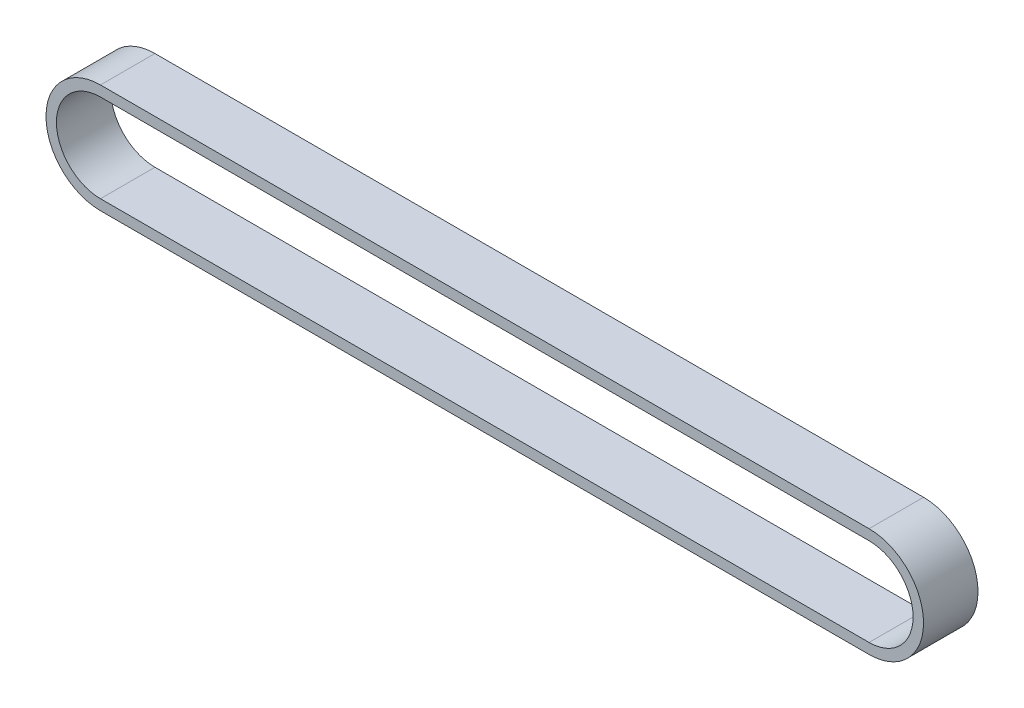
ISO-10303-21;
HEADER;
FILE_DESCRIPTION(('STEP AP214'),'2;1');
FILE_NAME('part.step','',(''),(''),'','','');
FILE_SCHEMA(('AUTOMOTIVE_DESIGN { 1 0 10303 214 1 1 1 1 }'));
ENDSEC;
DATA;
#1=APPLICATION_CONTEXT('core data for automotive mechanical design processes');
#2=APPLICATION_PROTOCOL_DEFINITION('international standard','automotive_design',2000,#1);
#3=PRODUCT_CONTEXT('',#1,'mechanical');
#4=PRODUCT('Part','Part','',(#3));
#5=PRODUCT_RELATED_PRODUCT_CATEGORY('part','',(#4));
#6=PRODUCT_DEFINITION_FORMATION('','',#4);
#7=PRODUCT_DEFINITION_CONTEXT('part definition',#1,'design');
#8=PRODUCT_DEFINITION('design','',#6,#7);
#9=PRODUCT_DEFINITION_SHAPE('','',#8);
#10=(LENGTH_UNIT() NAMED_UNIT(*) SI_UNIT(.MILLI.,.METRE.));
#11=(NAMED_UNIT(*) PLANE_ANGLE_UNIT() SI_UNIT($,.RADIAN.));
#12=(NAMED_UNIT(*) SI_UNIT($,.STERADIAN.) SOLID_ANGLE_UNIT());
#13=UNCERTAINTY_MEASURE_WITH_UNIT(LENGTH_MEASURE(1.E-05),#10,'distance_accuracy_value','');
#14=(GEOMETRIC_REPRESENTATION_CONTEXT(3) GLOBAL_UNCERTAINTY_ASSIGNED_CONTEXT((#13)) GLOBAL_UNIT_ASSIGNED_CONTEXT((#10,
#11,#12)) REPRESENTATION_CONTEXT('',''));
#15=CARTESIAN_POINT('',(0.,0.,0.));
#16=DIRECTION('',(0.,0.,1.));
#17=DIRECTION('',(1.,0.,0.));
#18=AXIS2_PLACEMENT_3D('',#15,#16,#17);
#19=CARTESIAN_POINT('',(-43.1077694235589,13.5338345864662,6.));
#20=DIRECTION('',(0.,0.,1.));
#21=DIRECTION('',(1.,0.,0.));
#22=AXIS2_PLACEMENT_3D('',#19,#20,#21);
#23=PLANE('',#22);
#24=CARTESIAN_POINT('',(-43.1077694235589,13.5338345864662,6.));
#25=DIRECTION('',(0.,0.,1.));
#26=DIRECTION('',(1.,0.,0.));
#27=AXIS2_PLACEMENT_3D('',#24,#25,#26);
#28=CIRCLE('',#27,6.);
#29=CARTESIAN_POINT('',(-43.1077694235589,19.5338345864662,6.));
#30=VERTEX_POINT('',#29);
#31=CARTESIAN_POINT('',(-43.1077694235589,7.53383458646616,6.));
#32=VERTEX_POINT('',#31);
#33=EDGE_CURVE('E134',#30,#32,#28,.T.);
#34=ORIENTED_EDGE('',*,*,#33,.T.);
#35=DIRECTION('',(1.,0.,0.));
#36=VECTOR('',#35,1.);
#37=CARTESIAN_POINT('',(-43.1077694235589,7.53383458646616,6.));
#38=LINE('',#37,#36);
#39=CARTESIAN_POINT('',(41.5422305764411,7.53383458646616,6.));
#40=VERTEX_POINT('',#39);
#41=EDGE_CURVE('E137',#32,#40,#38,.T.);
#42=ORIENTED_EDGE('',*,*,#41,.T.);
#43=CARTESIAN_POINT('',(41.5422305764411,13.5338345864662,6.));
#44=DIRECTION('',(0.,0.,1.));
#45=DIRECTION('',(1.,0.,0.));
#46=AXIS2_PLACEMENT_3D('',#43,#44,#45);
#47=CIRCLE('',#46,6.);
#48=CARTESIAN_POINT('',(41.5422305764411,19.5338345864662,6.));
#49=VERTEX_POINT('',#48);
#50=EDGE_CURVE('E140',#40,#49,#47,.T.);
#51=ORIENTED_EDGE('',*,*,#50,.T.);
#52=DIRECTION('',(-1.,0.,0.));
#53=VECTOR('',#52,1.);
#54=CARTESIAN_POINT('',(-43.1077694235589,19.5338345864662,6.));
#55=LINE('',#54,#53);
#56=EDGE_CURVE('E142',#49,#30,#55,.T.);
#57=ORIENTED_EDGE('',*,*,#56,.T.);
#58=EDGE_LOOP('',(#34,#42,#51,#57));
#59=FACE_BOUND('',#58,.T.);
#60=DIRECTION('',(1.,0.,0.));
#61=VECTOR('',#60,1.);
#62=CARTESIAN_POINT('',(-43.1077694235589,8.68383458646616,6.));
#63=LINE('',#62,#61);
#64=CARTESIAN_POINT('',(-43.1077694235589,8.68383458646616,6.));
#65=VERTEX_POINT('',#64);
#66=CARTESIAN_POINT('',(41.5422305764411,8.68383458646616,6.));
#67=VERTEX_POINT('',#66);
#68=EDGE_CURVE('E106',#65,#67,#63,.T.);
#69=ORIENTED_EDGE('',*,*,#68,.F.);
#70=CARTESIAN_POINT('',(-43.1077694235589,13.5338345864662,6.));
#71=DIRECTION('',(0.,0.,1.));
#72=DIRECTION('',(1.,0.,0.));
#73=AXIS2_PLACEMENT_3D('',#70,#71,#72);
#74=CIRCLE('',#73,4.85);
#75=CARTESIAN_POINT('',(-43.1077694235589,18.3838345864662,6.));
#76=VERTEX_POINT('',#75);
#77=EDGE_CURVE('E98',#76,#65,#74,.T.);
#78=ORIENTED_EDGE('',*,*,#77,.F.);
#79=DIRECTION('',(-1.,0.,0.));
#80=VECTOR('',#79,1.);
#81=CARTESIAN_POINT('',(-43.1077694235589,18.3838345864662,6.));
#82=LINE('',#81,#80);
#83=CARTESIAN_POINT('',(41.5422305764411,18.3838345864662,6.));
#84=VERTEX_POINT('',#83);
#85=EDGE_CURVE('E120',#84,#76,#82,.T.);
#86=ORIENTED_EDGE('',*,*,#85,.F.);
#87=CARTESIAN_POINT('',(41.5422305764411,13.5338345864662,6.));
#88=DIRECTION('',(0.,0.,1.));
#89=DIRECTION('',(1.,0.,0.));
#90=AXIS2_PLACEMENT_3D('',#87,#88,#89);
#91=CIRCLE('',#90,4.85);
#92=EDGE_CURVE('E118',#67,#84,#91,.T.);
#93=ORIENTED_EDGE('',*,*,#92,.F.);
#94=EDGE_LOOP('',(#69,#78,#86,#93));
#95=FACE_BOUND('',#94,.T.);
#96=ADVANCED_FACE('F33',(#59,#95),#23,.T.);
#97=CARTESIAN_POINT('',(-43.1077694235589,13.5338345864662,0.));
#98=DIRECTION('',(0.,0.,1.));
#99=DIRECTION('',(1.,0.,0.));
#100=AXIS2_PLACEMENT_3D('',#97,#98,#99);
#101=PLANE('',#100);
#102=CARTESIAN_POINT('',(-43.1077694235589,13.5338345864662,0.));
#103=DIRECTION('',(0.,0.,1.));
#104=DIRECTION('',(1.,0.,0.));
#105=AXIS2_PLACEMENT_3D('',#102,#103,#104);
#106=CIRCLE('',#105,6.);
#107=CARTESIAN_POINT('',(-43.1077694235589,19.5338345864662,0.));
#108=VERTEX_POINT('',#107);
#109=CARTESIAN_POINT('',(-43.1077694235589,7.53383458646616,0.));
#110=VERTEX_POINT('',#109);
#111=EDGE_CURVE('E114',#108,#110,#106,.T.);
#112=ORIENTED_EDGE('',*,*,#111,.F.);
#113=DIRECTION('',(-1.,0.,0.));
#114=VECTOR('',#113,1.);
#115=CARTESIAN_POINT('',(-43.1077694235589,19.5338345864662,0.));
#116=LINE('',#115,#114);
#117=CARTESIAN_POINT('',(41.5422305764411,19.5338345864662,0.));
#118=VERTEX_POINT('',#117);
#119=EDGE_CURVE('E138',#118,#108,#116,.T.);
#120=ORIENTED_EDGE('',*,*,#119,.F.);
#121=CARTESIAN_POINT('',(41.5422305764411,13.5338345864662,0.));
#122=DIRECTION('',(0.,0.,1.));
#123=DIRECTION('',(1.,0.,0.));
#124=AXIS2_PLACEMENT_3D('',#121,#122,#123);
#125=CIRCLE('',#124,6.);
#126=CARTESIAN_POINT('',(41.5422305764411,7.53383458646616,0.));
#127=VERTEX_POINT('',#126);
#128=EDGE_CURVE('E149',#127,#118,#125,.T.);
#129=ORIENTED_EDGE('',*,*,#128,.F.);
#130=DIRECTION('',(1.,0.,0.));
#131=VECTOR('',#130,1.);
#132=CARTESIAN_POINT('',(-43.1077694235589,7.53383458646616,0.));
#133=LINE('',#132,#131);
#134=EDGE_CURVE('E147',#110,#127,#133,.T.);
#135=ORIENTED_EDGE('',*,*,#134,.F.);
#136=EDGE_LOOP('',(#112,#120,#129,#135));
#137=FACE_BOUND('',#136,.T.);
#138=CARTESIAN_POINT('',(-43.1077694235589,13.5338345864662,0.));
#139=DIRECTION('',(0.,0.,1.));
#140=DIRECTION('',(1.,0.,0.));
#141=AXIS2_PLACEMENT_3D('',#138,#139,#140);
#142=CIRCLE('',#141,4.85);
#143=CARTESIAN_POINT('',(-43.1077694235589,18.3838345864662,0.));
#144=VERTEX_POINT('',#143);
#145=CARTESIAN_POINT('',(-43.1077694235589,8.68383458646616,0.));
#146=VERTEX_POINT('',#145);
#147=EDGE_CURVE('E56',#144,#146,#142,.T.);
#148=ORIENTED_EDGE('',*,*,#147,.T.);
#149=DIRECTION('',(1.,0.,0.));
#150=VECTOR('',#149,1.);
#151=CARTESIAN_POINT('',(-43.1077694235589,8.68383458646616,0.));
#152=LINE('',#151,#150);
#153=CARTESIAN_POINT('',(41.5422305764411,8.68383458646616,0.));
#154=VERTEX_POINT('',#153);
#155=EDGE_CURVE('E113',#146,#154,#152,.T.);
#156=ORIENTED_EDGE('',*,*,#155,.T.);
#157=CARTESIAN_POINT('',(41.5422305764411,13.5338345864662,0.));
#158=DIRECTION('',(0.,0.,1.));
#159=DIRECTION('',(1.,0.,0.));
#160=AXIS2_PLACEMENT_3D('',#157,#158,#159);
#161=CIRCLE('',#160,4.85);
#162=CARTESIAN_POINT('',(41.5422305764411,18.3838345864662,0.));
#163=VERTEX_POINT('',#162);
#164=EDGE_CURVE('E126',#154,#163,#161,.T.);
#165=ORIENTED_EDGE('',*,*,#164,.T.);
#166=DIRECTION('',(-1.,0.,0.));
#167=VECTOR('',#166,1.);
#168=CARTESIAN_POINT('',(-43.1077694235589,18.3838345864662,0.));
#169=LINE('',#168,#167);
#170=EDGE_CURVE('E107',#163,#144,#169,.T.);
#171=ORIENTED_EDGE('',*,*,#170,.T.);
#172=EDGE_LOOP('',(#148,#156,#165,#171));
#173=FACE_BOUND('',#172,.T.);
#174=ADVANCED_FACE('F167',(#137,#173),#101,.F.);
#175=CARTESIAN_POINT('',(-43.1077694235589,13.5338345864662,6.));
#176=DIRECTION('',(0.,0.,-1.));
#177=DIRECTION('',(-1.,0.,0.));
#178=AXIS2_PLACEMENT_3D('',#175,#176,#177);
#179=CYLINDRICAL_SURFACE('',#178,6.);
#180=ORIENTED_EDGE('',*,*,#111,.T.);
#181=DIRECTION('',(0.,0.,-1.));
#182=VECTOR('',#181,1.);
#183=CARTESIAN_POINT('',(-43.1077694235589,7.53383458646616,6.));
#184=LINE('',#183,#182);
#185=EDGE_CURVE('E11',#32,#110,#184,.T.);
#186=ORIENTED_EDGE('',*,*,#185,.F.);
#187=ORIENTED_EDGE('',*,*,#33,.F.);
#188=DIRECTION('',(0.,0.,-1.));
#189=VECTOR('',#188,1.);
#190=CARTESIAN_POINT('',(-43.1077694235589,19.5338345864662,6.));
#191=LINE('',#190,#189);
#192=EDGE_CURVE('E144',#30,#108,#191,.T.);
#193=ORIENTED_EDGE('',*,*,#192,.T.);
#194=EDGE_LOOP('',(#180,#186,#187,#193));
#195=FACE_BOUND('',#194,.T.);
#196=ADVANCED_FACE('F35',(#195),#179,.T.);
#197=CARTESIAN_POINT('',(-43.1077694235589,7.53383458646616,6.));
#198=DIRECTION('',(0.,1.,0.));
#199=DIRECTION('',(-1.,0.,0.));
#200=AXIS2_PLACEMENT_3D('',#197,#198,#199);
#201=PLANE('',#200);
#202=ORIENTED_EDGE('',*,*,#134,.T.);
#203=DIRECTION('',(0.,0.,-1.));
#204=VECTOR('',#203,1.);
#205=CARTESIAN_POINT('',(41.5422305764411,7.53383458646616,6.));
#206=LINE('',#205,#204);
#207=EDGE_CURVE('E41',#40,#127,#206,.T.);
#208=ORIENTED_EDGE('',*,*,#207,.F.);
#209=ORIENTED_EDGE('',*,*,#41,.F.);
#210=ORIENTED_EDGE('',*,*,#185,.T.);
#211=EDGE_LOOP('',(#202,#208,#209,#210));
#212=FACE_BOUND('',#211,.T.);
#213=ADVANCED_FACE('F177',(#212),#201,.F.);
#214=CARTESIAN_POINT('',(41.5422305764411,13.5338345864662,6.));
#215=DIRECTION('',(0.,0.,-1.));
#216=DIRECTION('',(-1.,0.,0.));
#217=AXIS2_PLACEMENT_3D('',#214,#215,#216);
#218=CYLINDRICAL_SURFACE('',#217,6.);
#219=ORIENTED_EDGE('',*,*,#128,.T.);
#220=DIRECTION('',(0.,0.,-1.));
#221=VECTOR('',#220,1.);
#222=CARTESIAN_POINT('',(41.5422305764411,19.5338345864662,6.));
#223=LINE('',#222,#221);
#224=EDGE_CURVE('E154',#49,#118,#223,.T.);
#225=ORIENTED_EDGE('',*,*,#224,.F.);
#226=ORIENTED_EDGE('',*,*,#50,.F.);
#227=ORIENTED_EDGE('',*,*,#207,.T.);
#228=EDGE_LOOP('',(#219,#225,#226,#227));
#229=FACE_BOUND('',#228,.T.);
#230=ADVANCED_FACE('F161',(#229),#218,.T.);
#231=CARTESIAN_POINT('',(-43.1077694235589,19.5338345864662,6.));
#232=DIRECTION('',(0.,-1.,0.));
#233=DIRECTION('',(0.,0.,-1.));
#234=AXIS2_PLACEMENT_3D('',#231,#232,#233);
#235=PLANE('',#234);
#236=ORIENTED_EDGE('',*,*,#119,.T.);
#237=ORIENTED_EDGE('',*,*,#192,.F.);
#238=ORIENTED_EDGE('',*,*,#56,.F.);
#239=ORIENTED_EDGE('',*,*,#224,.T.);
#240=EDGE_LOOP('',(#236,#237,#238,#239));
#241=FACE_BOUND('',#240,.T.);
#242=ADVANCED_FACE('F171',(#241),#235,.F.);
#243=CARTESIAN_POINT('',(-43.1077694235589,13.5338345864662,6.));
#244=DIRECTION('',(0.,0.,-1.));
#245=DIRECTION('',(-1.,0.,0.));
#246=AXIS2_PLACEMENT_3D('',#243,#244,#245);
#247=CYLINDRICAL_SURFACE('',#246,4.85);
#248=ORIENTED_EDGE('',*,*,#147,.F.);
#249=DIRECTION('',(0.,0.,-1.));
#250=VECTOR('',#249,1.);
#251=CARTESIAN_POINT('',(-43.1077694235589,18.3838345864662,6.));
#252=LINE('',#251,#250);
#253=EDGE_CURVE('E102',#76,#144,#252,.T.);
#254=ORIENTED_EDGE('',*,*,#253,.F.);
#255=ORIENTED_EDGE('',*,*,#77,.T.);
#256=DIRECTION('',(0.,0.,-1.));
#257=VECTOR('',#256,1.);
#258=CARTESIAN_POINT('',(-43.1077694235589,8.68383458646616,6.));
#259=LINE('',#258,#257);
#260=EDGE_CURVE('E101',#65,#146,#259,.T.);
#261=ORIENTED_EDGE('',*,*,#260,.T.);
#262=EDGE_LOOP('',(#248,#254,#255,#261));
#263=FACE_BOUND('',#262,.T.);
#264=ADVANCED_FACE('F100',(#263),#247,.F.);
#265=CARTESIAN_POINT('',(-43.1077694235589,8.68383458646616,6.));
#266=DIRECTION('',(0.,1.,0.));
#267=DIRECTION('',(0.,0.,1.));
#268=AXIS2_PLACEMENT_3D('',#265,#266,#267);
#269=PLANE('',#268);
#270=ORIENTED_EDGE('',*,*,#155,.F.);
#271=ORIENTED_EDGE('',*,*,#260,.F.);
#272=ORIENTED_EDGE('',*,*,#68,.T.);
#273=DIRECTION('',(0.,0.,-1.));
#274=VECTOR('',#273,1.);
#275=CARTESIAN_POINT('',(41.5422305764411,8.68383458646616,6.));
#276=LINE('',#275,#274);
#277=EDGE_CURVE('E115',#67,#154,#276,.T.);
#278=ORIENTED_EDGE('',*,*,#277,.T.);
#279=EDGE_LOOP('',(#270,#271,#272,#278));
#280=FACE_BOUND('',#279,.T.);
#281=ADVANCED_FACE('F110',(#280),#269,.T.);
#282=CARTESIAN_POINT('',(41.5422305764411,13.5338345864662,6.));
#283=DIRECTION('',(0.,0.,-1.));
#284=DIRECTION('',(-1.,0.,0.));
#285=AXIS2_PLACEMENT_3D('',#282,#283,#284);
#286=CYLINDRICAL_SURFACE('',#285,4.85);
#287=ORIENTED_EDGE('',*,*,#164,.F.);
#288=ORIENTED_EDGE('',*,*,#277,.F.);
#289=ORIENTED_EDGE('',*,*,#92,.T.);
#290=DIRECTION('',(0.,0.,-1.));
#291=VECTOR('',#290,1.);
#292=CARTESIAN_POINT('',(41.5422305764411,18.3838345864662,6.));
#293=LINE('',#292,#291);
#294=EDGE_CURVE('E48',#84,#163,#293,.T.);
#295=ORIENTED_EDGE('',*,*,#294,.T.);
#296=EDGE_LOOP('',(#287,#288,#289,#295));
#297=FACE_BOUND('',#296,.T.);
#298=ADVANCED_FACE('F200',(#297),#286,.F.);
#299=CARTESIAN_POINT('',(-43.1077694235589,18.3838345864662,6.));
#300=DIRECTION('',(0.,-1.,0.));
#301=DIRECTION('',(0.,0.,-1.));
#302=AXIS2_PLACEMENT_3D('',#299,#300,#301);
#303=PLANE('',#302);
#304=ORIENTED_EDGE('',*,*,#170,.F.);
#305=ORIENTED_EDGE('',*,*,#294,.F.);
#306=ORIENTED_EDGE('',*,*,#85,.T.);
#307=ORIENTED_EDGE('',*,*,#253,.T.);
#308=EDGE_LOOP('',(#304,#305,#306,#307));
#309=FACE_BOUND('',#308,.T.);
#310=ADVANCED_FACE('F204',(#309),#303,.T.);
#311=CLOSED_SHELL('',(#96,#174,#196,#213,#230,#242,#264,#281,#298,#310));
#312=MANIFOLD_SOLID_BREP('B2',#311);
#313=ADVANCED_BREP_SHAPE_REPRESENTATION('',(#18,#312),#14);
#314=SHAPE_DEFINITION_REPRESENTATION(#9,#313);
ENDSEC;
END-ISO-10303-21;
